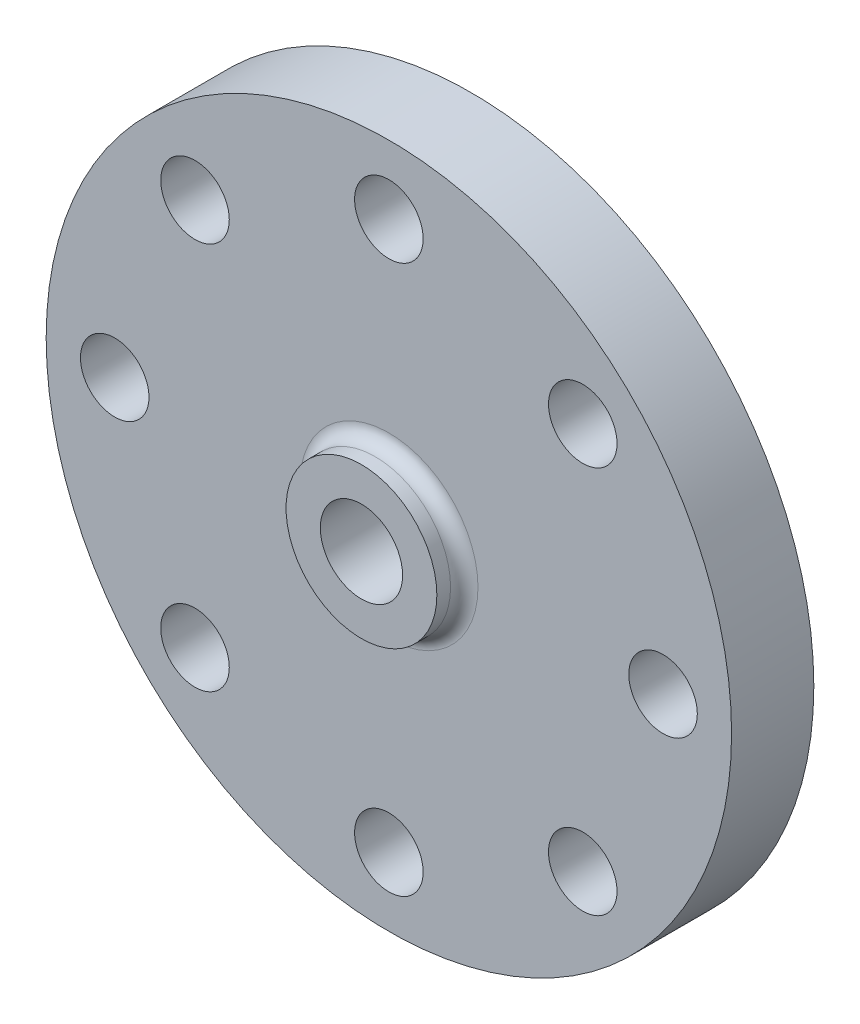
ISO-10303-21;
HEADER;
FILE_DESCRIPTION(('STEP AP214'),'2;1');
FILE_NAME('part.step','',(''),(''),'','','');
FILE_SCHEMA(('AUTOMOTIVE_DESIGN { 1 0 10303 214 1 1 1 1 }'));
ENDSEC;
DATA;
#1=APPLICATION_CONTEXT('core data for automotive mechanical design processes');
#2=APPLICATION_PROTOCOL_DEFINITION('international standard','automotive_design',2000,#1);
#3=PRODUCT_CONTEXT('',#1,'mechanical');
#4=PRODUCT('Part','Part','',(#3));
#5=PRODUCT_RELATED_PRODUCT_CATEGORY('part','',(#4));
#6=PRODUCT_DEFINITION_FORMATION('','',#4);
#7=PRODUCT_DEFINITION_CONTEXT('part definition',#1,'design');
#8=PRODUCT_DEFINITION('design','',#6,#7);
#9=PRODUCT_DEFINITION_SHAPE('','',#8);
#10=(LENGTH_UNIT() NAMED_UNIT(*) SI_UNIT(.MILLI.,.METRE.));
#11=(NAMED_UNIT(*) PLANE_ANGLE_UNIT() SI_UNIT($,.RADIAN.));
#12=(NAMED_UNIT(*) SI_UNIT($,.STERADIAN.) SOLID_ANGLE_UNIT());
#13=UNCERTAINTY_MEASURE_WITH_UNIT(LENGTH_MEASURE(1.E-05),#10,'distance_accuracy_value','');
#14=(GEOMETRIC_REPRESENTATION_CONTEXT(3) GLOBAL_UNCERTAINTY_ASSIGNED_CONTEXT((#13)) GLOBAL_UNIT_ASSIGNED_CONTEXT((#10,
#11,#12)) REPRESENTATION_CONTEXT('',''));
#15=CARTESIAN_POINT('',(0.,0.,0.));
#16=DIRECTION('',(0.,0.,1.));
#17=DIRECTION('',(1.,0.,0.));
#18=AXIS2_PLACEMENT_3D('',#15,#16,#17);
#19=CARTESIAN_POINT('',(0.,0.,3.));
#20=DIRECTION('',(0.,0.,-1.));
#21=DIRECTION('',(-1.,0.,0.));
#22=AXIS2_PLACEMENT_3D('',#19,#20,#21);
#23=CYLINDRICAL_SURFACE('',#22,1.5);
#24=CARTESIAN_POINT('',(0.,0.,4.));
#25=DIRECTION('',(0.,0.,1.));
#26=DIRECTION('',(1.,0.,0.));
#27=AXIS2_PLACEMENT_3D('',#24,#25,#26);
#28=CIRCLE('',#27,1.5);
#29=CARTESIAN_POINT('',(1.5,0.,4.));
#30=VERTEX_POINT('',#29);
#31=EDGE_CURVE('E110',#30,#30,#28,.T.);
#32=ORIENTED_EDGE('',*,*,#31,.T.);
#33=EDGE_LOOP('',(#32));
#34=FACE_BOUND('',#33,.T.);
#35=CARTESIAN_POINT('',(0.,0.,0.5));
#36=DIRECTION('',(0.,0.,-1.));
#37=DIRECTION('',(-1.,0.,0.));
#38=AXIS2_PLACEMENT_3D('',#35,#36,#37);
#39=CIRCLE('',#38,1.5);
#40=CARTESIAN_POINT('',(-1.5,0.,0.5));
#41=VERTEX_POINT('',#40);
#42=EDGE_CURVE('E117',#41,#41,#39,.T.);
#43=ORIENTED_EDGE('',*,*,#42,.T.);
#44=EDGE_LOOP('',(#43));
#45=FACE_BOUND('',#44,.T.);
#46=ADVANCED_FACE('F39',(#34,#45),#23,.F.);
#47=CARTESIAN_POINT('',(0.,0.,3.));
#48=DIRECTION('',(0.,0.,1.));
#49=DIRECTION('',(1.,0.,0.));
#50=AXIS2_PLACEMENT_3D('',#47,#48,#49);
#51=PLANE('',#50);
#52=CARTESIAN_POINT('',(0.,0.,3.));
#53=DIRECTION('',(0.,0.,1.));
#54=DIRECTION('',(1.,0.,0.));
#55=AXIS2_PLACEMENT_3D('',#52,#53,#54);
#56=CIRCLE('',#55,3.25);
#57=CARTESIAN_POINT('',(3.25,0.,3.));
#58=VERTEX_POINT('',#57);
#59=EDGE_CURVE('E10',#58,#58,#56,.F.);
#60=ORIENTED_EDGE('',*,*,#59,.T.);
#61=EDGE_LOOP('',(#60));
#62=FACE_BOUND('',#61,.T.);
#63=CARTESIAN_POINT('',(-7.07106781186539,7.07106781186556,3.));
#64=DIRECTION('',(0.,0.,1.));
#65=DIRECTION('',(1.,0.,0.));
#66=AXIS2_PLACEMENT_3D('',#63,#64,#65);
#67=CIRCLE('',#66,1.25);
#68=CARTESIAN_POINT('',(-5.82106781186539,7.07106781186556,3.));
#69=VERTEX_POINT('',#68);
#70=EDGE_CURVE('E99',#69,#69,#67,.T.);
#71=ORIENTED_EDGE('',*,*,#70,.F.);
#72=EDGE_LOOP('',(#71));
#73=FACE_BOUND('',#72,.T.);
#74=CARTESIAN_POINT('',(-7.07106781186554,-7.07106781186541,3.));
#75=DIRECTION('',(0.,0.,1.));
#76=DIRECTION('',(1.,0.,0.));
#77=AXIS2_PLACEMENT_3D('',#74,#75,#76);
#78=CIRCLE('',#77,1.25);
#79=CARTESIAN_POINT('',(-5.82106781186554,-7.07106781186541,3.));
#80=VERTEX_POINT('',#79);
#81=EDGE_CURVE('E87',#80,#80,#78,.T.);
#82=ORIENTED_EDGE('',*,*,#81,.F.);
#83=EDGE_LOOP('',(#82));
#84=FACE_BOUND('',#83,.T.);
#85=CARTESIAN_POINT('',(7.07106781186544,-7.07106781186551,3.));
#86=DIRECTION('',(0.,0.,1.));
#87=DIRECTION('',(1.,0.,0.));
#88=AXIS2_PLACEMENT_3D('',#85,#86,#87);
#89=CIRCLE('',#88,1.25);
#90=CARTESIAN_POINT('',(8.32106781186544,-7.07106781186551,3.));
#91=VERTEX_POINT('',#90);
#92=EDGE_CURVE('E75',#91,#91,#89,.T.);
#93=ORIENTED_EDGE('',*,*,#92,.F.);
#94=EDGE_LOOP('',(#93));
#95=FACE_BOUND('',#94,.T.);
#96=CARTESIAN_POINT('',(7.07106781186549,7.07106781186546,3.));
#97=DIRECTION('',(0.,0.,1.));
#98=DIRECTION('',(1.,0.,0.));
#99=AXIS2_PLACEMENT_3D('',#96,#97,#98);
#100=CIRCLE('',#99,1.25);
#101=CARTESIAN_POINT('',(8.32106781186549,7.07106781186546,3.));
#102=VERTEX_POINT('',#101);
#103=EDGE_CURVE('E63',#102,#102,#100,.T.);
#104=ORIENTED_EDGE('',*,*,#103,.F.);
#105=EDGE_LOOP('',(#104));
#106=FACE_BOUND('',#105,.T.);
#107=CARTESIAN_POINT('',(0.,10.,3.));
#108=DIRECTION('',(0.,0.,1.));
#109=DIRECTION('',(1.,0.,0.));
#110=AXIS2_PLACEMENT_3D('',#107,#108,#109);
#111=CIRCLE('',#110,1.25);
#112=CARTESIAN_POINT('',(1.25,10.,3.));
#113=VERTEX_POINT('',#112);
#114=EDGE_CURVE('E58',#113,#113,#111,.T.);
#115=ORIENTED_EDGE('',*,*,#114,.F.);
#116=EDGE_LOOP('',(#115));
#117=FACE_BOUND('',#116,.T.);
#118=CARTESIAN_POINT('',(0.,0.,3.));
#119=DIRECTION('',(0.,0.,1.));
#120=DIRECTION('',(1.,0.,0.));
#121=AXIS2_PLACEMENT_3D('',#118,#119,#120);
#122=CIRCLE('',#121,12.5);
#123=CARTESIAN_POINT('',(12.5,0.,3.));
#124=VERTEX_POINT('',#123);
#125=EDGE_CURVE('E50',#124,#124,#122,.T.);
#126=ORIENTED_EDGE('',*,*,#125,.T.);
#127=EDGE_LOOP('',(#126));
#128=FACE_BOUND('',#127,.T.);
#129=CARTESIAN_POINT('',(10.,0.,3.));
#130=DIRECTION('',(0.,0.,1.));
#131=DIRECTION('',(1.,0.,0.));
#132=AXIS2_PLACEMENT_3D('',#129,#130,#131);
#133=CIRCLE('',#132,1.25);
#134=CARTESIAN_POINT('',(11.25,0.,3.));
#135=VERTEX_POINT('',#134);
#136=EDGE_CURVE('E69',#135,#135,#133,.T.);
#137=ORIENTED_EDGE('',*,*,#136,.F.);
#138=EDGE_LOOP('',(#137));
#139=FACE_BOUND('',#138,.T.);
#140=CARTESIAN_POINT('',(0.,-10.,3.));
#141=DIRECTION('',(0.,0.,1.));
#142=DIRECTION('',(1.,0.,0.));
#143=AXIS2_PLACEMENT_3D('',#140,#141,#142);
#144=CIRCLE('',#143,1.25);
#145=CARTESIAN_POINT('',(1.24999999999993,-10.,3.));
#146=VERTEX_POINT('',#145);
#147=EDGE_CURVE('E81',#146,#146,#144,.T.);
#148=ORIENTED_EDGE('',*,*,#147,.F.);
#149=EDGE_LOOP('',(#148));
#150=FACE_BOUND('',#149,.T.);
#151=CARTESIAN_POINT('',(-10.,1.04744440165294E-13,3.));
#152=DIRECTION('',(0.,0.,1.));
#153=DIRECTION('',(1.,0.,0.));
#154=AXIS2_PLACEMENT_3D('',#151,#152,#153);
#155=CIRCLE('',#154,1.25);
#156=CARTESIAN_POINT('',(-8.75,1.04744440165294E-13,3.));
#157=VERTEX_POINT('',#156);
#158=EDGE_CURVE('E93',#157,#157,#155,.T.);
#159=ORIENTED_EDGE('',*,*,#158,.F.);
#160=EDGE_LOOP('',(#159));
#161=FACE_BOUND('',#160,.T.);
#162=ADVANCED_FACE('F140',(#62,#73,#84,#95,#106,#117,#128,#139,#150,#161),#51,.T.);
#163=CARTESIAN_POINT('',(0.,0.,0.));
#164=DIRECTION('',(0.,0.,1.));
#165=DIRECTION('',(1.,0.,0.));
#166=AXIS2_PLACEMENT_3D('',#163,#164,#165);
#167=PLANE('',#166);
#168=CARTESIAN_POINT('',(0.,0.,0.));
#169=DIRECTION('',(0.,0.,-1.));
#170=DIRECTION('',(-1.,0.,0.));
#171=AXIS2_PLACEMENT_3D('',#168,#169,#170);
#172=CIRCLE('',#171,3.5);
#173=CARTESIAN_POINT('',(-3.5,0.,0.));
#174=VERTEX_POINT('',#173);
#175=EDGE_CURVE('E114',#174,#174,#172,.T.);
#176=ORIENTED_EDGE('',*,*,#175,.F.);
#177=EDGE_LOOP('',(#176));
#178=FACE_BOUND('',#177,.T.);
#179=CARTESIAN_POINT('',(0.,0.,0.));
#180=DIRECTION('',(0.,0.,1.));
#181=DIRECTION('',(1.,0.,0.));
#182=AXIS2_PLACEMENT_3D('',#179,#180,#181);
#183=CIRCLE('',#182,12.5);
#184=CARTESIAN_POINT('',(12.5,0.,0.));
#185=VERTEX_POINT('',#184);
#186=EDGE_CURVE('E54',#185,#185,#183,.T.);
#187=ORIENTED_EDGE('',*,*,#186,.F.);
#188=EDGE_LOOP('',(#187));
#189=FACE_BOUND('',#188,.T.);
#190=CARTESIAN_POINT('',(0.,10.,0.));
#191=DIRECTION('',(0.,0.,1.));
#192=DIRECTION('',(1.,0.,0.));
#193=AXIS2_PLACEMENT_3D('',#190,#191,#192);
#194=CIRCLE('',#193,1.25);
#195=CARTESIAN_POINT('',(1.25,10.,0.));
#196=VERTEX_POINT('',#195);
#197=EDGE_CURVE('E60',#196,#196,#194,.T.);
#198=ORIENTED_EDGE('',*,*,#197,.T.);
#199=EDGE_LOOP('',(#198));
#200=FACE_BOUND('',#199,.T.);
#201=CARTESIAN_POINT('',(7.07106781186549,7.07106781186546,0.));
#202=DIRECTION('',(0.,0.,1.));
#203=DIRECTION('',(1.,0.,0.));
#204=AXIS2_PLACEMENT_3D('',#201,#202,#203);
#205=CIRCLE('',#204,1.25);
#206=CARTESIAN_POINT('',(8.32106781186549,7.07106781186546,0.));
#207=VERTEX_POINT('',#206);
#208=EDGE_CURVE('E66',#207,#207,#205,.T.);
#209=ORIENTED_EDGE('',*,*,#208,.T.);
#210=EDGE_LOOP('',(#209));
#211=FACE_BOUND('',#210,.T.);
#212=CARTESIAN_POINT('',(10.,0.,0.));
#213=DIRECTION('',(0.,0.,1.));
#214=DIRECTION('',(1.,0.,0.));
#215=AXIS2_PLACEMENT_3D('',#212,#213,#214);
#216=CIRCLE('',#215,1.25);
#217=CARTESIAN_POINT('',(11.25,0.,0.));
#218=VERTEX_POINT('',#217);
#219=EDGE_CURVE('E72',#218,#218,#216,.T.);
#220=ORIENTED_EDGE('',*,*,#219,.T.);
#221=EDGE_LOOP('',(#220));
#222=FACE_BOUND('',#221,.T.);
#223=CARTESIAN_POINT('',(7.07106781186544,-7.07106781186551,0.));
#224=DIRECTION('',(0.,0.,1.));
#225=DIRECTION('',(1.,0.,0.));
#226=AXIS2_PLACEMENT_3D('',#223,#224,#225);
#227=CIRCLE('',#226,1.25);
#228=CARTESIAN_POINT('',(8.32106781186544,-7.07106781186551,0.));
#229=VERTEX_POINT('',#228);
#230=EDGE_CURVE('E78',#229,#229,#227,.T.);
#231=ORIENTED_EDGE('',*,*,#230,.T.);
#232=EDGE_LOOP('',(#231));
#233=FACE_BOUND('',#232,.T.);
#234=CARTESIAN_POINT('',(0.,-10.,0.));
#235=DIRECTION('',(0.,0.,1.));
#236=DIRECTION('',(1.,0.,0.));
#237=AXIS2_PLACEMENT_3D('',#234,#235,#236);
#238=CIRCLE('',#237,1.25);
#239=CARTESIAN_POINT('',(1.24999999999993,-10.,0.));
#240=VERTEX_POINT('',#239);
#241=EDGE_CURVE('E84',#240,#240,#238,.T.);
#242=ORIENTED_EDGE('',*,*,#241,.T.);
#243=EDGE_LOOP('',(#242));
#244=FACE_BOUND('',#243,.T.);
#245=CARTESIAN_POINT('',(-7.07106781186554,-7.07106781186541,0.));
#246=DIRECTION('',(0.,0.,1.));
#247=DIRECTION('',(1.,0.,0.));
#248=AXIS2_PLACEMENT_3D('',#245,#246,#247);
#249=CIRCLE('',#248,1.25);
#250=CARTESIAN_POINT('',(-5.82106781186554,-7.07106781186541,0.));
#251=VERTEX_POINT('',#250);
#252=EDGE_CURVE('E90',#251,#251,#249,.T.);
#253=ORIENTED_EDGE('',*,*,#252,.T.);
#254=EDGE_LOOP('',(#253));
#255=FACE_BOUND('',#254,.T.);
#256=CARTESIAN_POINT('',(-10.,1.04744440165294E-13,0.));
#257=DIRECTION('',(0.,0.,1.));
#258=DIRECTION('',(1.,0.,0.));
#259=AXIS2_PLACEMENT_3D('',#256,#257,#258);
#260=CIRCLE('',#259,1.25);
#261=CARTESIAN_POINT('',(-8.75,1.04744440165294E-13,0.));
#262=VERTEX_POINT('',#261);
#263=EDGE_CURVE('E96',#262,#262,#260,.T.);
#264=ORIENTED_EDGE('',*,*,#263,.T.);
#265=EDGE_LOOP('',(#264));
#266=FACE_BOUND('',#265,.T.);
#267=CARTESIAN_POINT('',(-7.07106781186539,7.07106781186556,0.));
#268=DIRECTION('',(0.,0.,1.));
#269=DIRECTION('',(1.,0.,0.));
#270=AXIS2_PLACEMENT_3D('',#267,#268,#269);
#271=CIRCLE('',#270,1.25);
#272=CARTESIAN_POINT('',(-5.82106781186539,7.07106781186556,0.));
#273=VERTEX_POINT('',#272);
#274=EDGE_CURVE('E102',#273,#273,#271,.T.);
#275=ORIENTED_EDGE('',*,*,#274,.T.);
#276=EDGE_LOOP('',(#275));
#277=FACE_BOUND('',#276,.T.);
#278=ADVANCED_FACE('F136',(#178,#189,#200,#211,#222,#233,#244,#255,#266,#277),#167,.F.);
#279=CARTESIAN_POINT('',(0.,0.,3.));
#280=DIRECTION('',(0.,0.,-1.));
#281=DIRECTION('',(-1.,0.,0.));
#282=AXIS2_PLACEMENT_3D('',#279,#280,#281);
#283=CYLINDRICAL_SURFACE('',#282,12.5);
#284=ORIENTED_EDGE('',*,*,#125,.F.);
#285=EDGE_LOOP('',(#284));
#286=FACE_BOUND('',#285,.T.);
#287=ORIENTED_EDGE('',*,*,#186,.T.);
#288=EDGE_LOOP('',(#287));
#289=FACE_BOUND('',#288,.T.);
#290=ADVANCED_FACE('F139',(#286,#289),#283,.T.);
#291=CARTESIAN_POINT('',(0.,10.,3.));
#292=DIRECTION('',(0.,0.,-1.));
#293=DIRECTION('',(-1.,0.,0.));
#294=AXIS2_PLACEMENT_3D('',#291,#292,#293);
#295=CYLINDRICAL_SURFACE('',#294,1.25);
#296=ORIENTED_EDGE('',*,*,#114,.T.);
#297=EDGE_LOOP('',(#296));
#298=FACE_BOUND('',#297,.T.);
#299=ORIENTED_EDGE('',*,*,#197,.F.);
#300=EDGE_LOOP('',(#299));
#301=FACE_BOUND('',#300,.T.);
#302=ADVANCED_FACE('F189',(#298,#301),#295,.F.);
#303=CARTESIAN_POINT('',(7.07106781186549,7.07106781186546,3.));
#304=DIRECTION('',(0.,0.,-1.));
#305=DIRECTION('',(-1.,0.,0.));
#306=AXIS2_PLACEMENT_3D('',#303,#304,#305);
#307=CYLINDRICAL_SURFACE('',#306,1.25);
#308=ORIENTED_EDGE('',*,*,#103,.T.);
#309=EDGE_LOOP('',(#308));
#310=FACE_BOUND('',#309,.T.);
#311=ORIENTED_EDGE('',*,*,#208,.F.);
#312=EDGE_LOOP('',(#311));
#313=FACE_BOUND('',#312,.T.);
#314=ADVANCED_FACE('F187',(#310,#313),#307,.F.);
#315=CARTESIAN_POINT('',(10.,0.,3.));
#316=DIRECTION('',(0.,0.,-1.));
#317=DIRECTION('',(-1.,0.,0.));
#318=AXIS2_PLACEMENT_3D('',#315,#316,#317);
#319=CYLINDRICAL_SURFACE('',#318,1.25);
#320=ORIENTED_EDGE('',*,*,#136,.T.);
#321=EDGE_LOOP('',(#320));
#322=FACE_BOUND('',#321,.T.);
#323=ORIENTED_EDGE('',*,*,#219,.F.);
#324=EDGE_LOOP('',(#323));
#325=FACE_BOUND('',#324,.T.);
#326=ADVANCED_FACE('F218',(#322,#325),#319,.F.);
#327=CARTESIAN_POINT('',(7.07106781186544,-7.07106781186551,3.));
#328=DIRECTION('',(0.,0.,-1.));
#329=DIRECTION('',(-1.,0.,0.));
#330=AXIS2_PLACEMENT_3D('',#327,#328,#329);
#331=CYLINDRICAL_SURFACE('',#330,1.25);
#332=ORIENTED_EDGE('',*,*,#92,.T.);
#333=EDGE_LOOP('',(#332));
#334=FACE_BOUND('',#333,.T.);
#335=ORIENTED_EDGE('',*,*,#230,.F.);
#336=EDGE_LOOP('',(#335));
#337=FACE_BOUND('',#336,.T.);
#338=ADVANCED_FACE('F210',(#334,#337),#331,.F.);
#339=CARTESIAN_POINT('',(0.,-10.,3.));
#340=DIRECTION('',(0.,0.,-1.));
#341=DIRECTION('',(-1.,0.,0.));
#342=AXIS2_PLACEMENT_3D('',#339,#340,#341);
#343=CYLINDRICAL_SURFACE('',#342,1.25);
#344=ORIENTED_EDGE('',*,*,#147,.T.);
#345=EDGE_LOOP('',(#344));
#346=FACE_BOUND('',#345,.T.);
#347=ORIENTED_EDGE('',*,*,#241,.F.);
#348=EDGE_LOOP('',(#347));
#349=FACE_BOUND('',#348,.T.);
#350=ADVANCED_FACE('F207',(#346,#349),#343,.F.);
#351=CARTESIAN_POINT('',(-7.07106781186554,-7.07106781186541,3.));
#352=DIRECTION('',(0.,0.,-1.));
#353=DIRECTION('',(-1.,0.,0.));
#354=AXIS2_PLACEMENT_3D('',#351,#352,#353);
#355=CYLINDRICAL_SURFACE('',#354,1.25);
#356=ORIENTED_EDGE('',*,*,#81,.T.);
#357=EDGE_LOOP('',(#356));
#358=FACE_BOUND('',#357,.T.);
#359=ORIENTED_EDGE('',*,*,#252,.F.);
#360=EDGE_LOOP('',(#359));
#361=FACE_BOUND('',#360,.T.);
#362=ADVANCED_FACE('F173',(#358,#361),#355,.F.);
#363=CARTESIAN_POINT('',(-10.,1.04744440165294E-13,3.));
#364=DIRECTION('',(0.,0.,-1.));
#365=DIRECTION('',(-1.,0.,0.));
#366=AXIS2_PLACEMENT_3D('',#363,#364,#365);
#367=CYLINDRICAL_SURFACE('',#366,1.25);
#368=ORIENTED_EDGE('',*,*,#158,.T.);
#369=EDGE_LOOP('',(#368));
#370=FACE_BOUND('',#369,.T.);
#371=ORIENTED_EDGE('',*,*,#263,.F.);
#372=EDGE_LOOP('',(#371));
#373=FACE_BOUND('',#372,.T.);
#374=ADVANCED_FACE('F163',(#370,#373),#367,.F.);
#375=CARTESIAN_POINT('',(-7.07106781186539,7.07106781186556,3.));
#376=DIRECTION('',(0.,0.,-1.));
#377=DIRECTION('',(-1.,0.,0.));
#378=AXIS2_PLACEMENT_3D('',#375,#376,#377);
#379=CYLINDRICAL_SURFACE('',#378,1.25);
#380=ORIENTED_EDGE('',*,*,#70,.T.);
#381=EDGE_LOOP('',(#380));
#382=FACE_BOUND('',#381,.T.);
#383=ORIENTED_EDGE('',*,*,#274,.F.);
#384=EDGE_LOOP('',(#383));
#385=FACE_BOUND('',#384,.T.);
#386=ADVANCED_FACE('F160',(#382,#385),#379,.F.);
#387=CARTESIAN_POINT('',(0.,0.,4.));
#388=DIRECTION('',(0.,0.,1.));
#389=DIRECTION('',(1.,0.,0.));
#390=AXIS2_PLACEMENT_3D('',#387,#388,#389);
#391=PLANE('',#390);
#392=CARTESIAN_POINT('',(0.,0.,4.));
#393=DIRECTION('',(0.,0.,1.));
#394=DIRECTION('',(1.,0.,0.));
#395=AXIS2_PLACEMENT_3D('',#392,#393,#394);
#396=CIRCLE('',#395,2.75);
#397=CARTESIAN_POINT('',(2.75,0.,4.));
#398=VERTEX_POINT('',#397);
#399=EDGE_CURVE('E105',#398,#398,#396,.T.);
#400=ORIENTED_EDGE('',*,*,#399,.T.);
#401=EDGE_LOOP('',(#400));
#402=FACE_BOUND('',#401,.T.);
#403=ORIENTED_EDGE('',*,*,#31,.F.);
#404=EDGE_LOOP('',(#403));
#405=FACE_BOUND('',#404,.T.);
#406=ADVANCED_FACE('F162',(#402,#405),#391,.T.);
#407=CARTESIAN_POINT('',(0.,0.,4.));
#408=DIRECTION('',(0.,0.,-1.));
#409=DIRECTION('',(-1.,0.,0.));
#410=AXIS2_PLACEMENT_3D('',#407,#408,#409);
#411=CYLINDRICAL_SURFACE('',#410,2.75);
#412=CARTESIAN_POINT('',(0.,0.,3.5));
#413=DIRECTION('',(0.,0.,1.));
#414=DIRECTION('',(1.,0.,0.));
#415=AXIS2_PLACEMENT_3D('',#412,#413,#414);
#416=CIRCLE('',#415,2.75);
#417=CARTESIAN_POINT('',(2.75,0.,3.5));
#418=VERTEX_POINT('',#417);
#419=EDGE_CURVE('E46',#418,#418,#416,.T.);
#420=ORIENTED_EDGE('',*,*,#419,.T.);
#421=EDGE_LOOP('',(#420));
#422=FACE_BOUND('',#421,.T.);
#423=ORIENTED_EDGE('',*,*,#399,.F.);
#424=EDGE_LOOP('',(#423));
#425=FACE_BOUND('',#424,.T.);
#426=ADVANCED_FACE('F170',(#422,#425),#411,.T.);
#427=CARTESIAN_POINT('',(0.,0.,3.5));
#428=DIRECTION('',(0.,0.,1.));
#429=DIRECTION('',(1.,0.,0.));
#430=AXIS2_PLACEMENT_3D('',#427,#428,#429);
#431=TOROIDAL_SURFACE('',#430,3.25,0.5);
#432=ORIENTED_EDGE('',*,*,#59,.F.);
#433=EDGE_LOOP('',(#432));
#434=FACE_BOUND('',#433,.T.);
#435=ORIENTED_EDGE('',*,*,#419,.F.);
#436=EDGE_LOOP('',(#435));
#437=FACE_BOUND('',#436,.T.);
#438=ADVANCED_FACE('F41',(#434,#437),#431,.F.);
#439=CARTESIAN_POINT('',(0.,0.,0.5));
#440=DIRECTION('',(0.,0.,-1.));
#441=DIRECTION('',(-1.,0.,0.));
#442=AXIS2_PLACEMENT_3D('',#439,#440,#441);
#443=CYLINDRICAL_SURFACE('',#442,3.5);
#444=CARTESIAN_POINT('',(0.,0.,0.5));
#445=DIRECTION('',(0.,0.,-1.));
#446=DIRECTION('',(-1.,0.,0.));
#447=AXIS2_PLACEMENT_3D('',#444,#445,#446);
#448=CIRCLE('',#447,3.5);
#449=CARTESIAN_POINT('',(-3.5,0.,0.5));
#450=VERTEX_POINT('',#449);
#451=EDGE_CURVE('E113',#450,#450,#448,.T.);
#452=ORIENTED_EDGE('',*,*,#451,.F.);
#453=EDGE_LOOP('',(#452));
#454=FACE_BOUND('',#453,.T.);
#455=ORIENTED_EDGE('',*,*,#175,.T.);
#456=EDGE_LOOP('',(#455));
#457=FACE_BOUND('',#456,.T.);
#458=ADVANCED_FACE('F127',(#454,#457),#443,.F.);
#459=CARTESIAN_POINT('',(0.,0.,0.5));
#460=DIRECTION('',(0.,0.,-1.));
#461=DIRECTION('',(-1.,0.,0.));
#462=AXIS2_PLACEMENT_3D('',#459,#460,#461);
#463=PLANE('',#462);
#464=ORIENTED_EDGE('',*,*,#42,.F.);
#465=EDGE_LOOP('',(#464));
#466=FACE_BOUND('',#465,.T.);
#467=ORIENTED_EDGE('',*,*,#451,.T.);
#468=EDGE_LOOP('',(#467));
#469=FACE_BOUND('',#468,.T.);
#470=ADVANCED_FACE('F124',(#466,#469),#463,.T.);
#471=CLOSED_SHELL('',(#46,#162,#278,#290,#302,#314,#326,#338,#350,#362,#374,#386,#406,#426,#438,
#458,#470));
#472=MANIFOLD_SOLID_BREP('B2',#471);
#473=ADVANCED_BREP_SHAPE_REPRESENTATION('',(#18,#472),#14);
#474=SHAPE_DEFINITION_REPRESENTATION(#9,#473);
ENDSEC;
END-ISO-10303-21;
